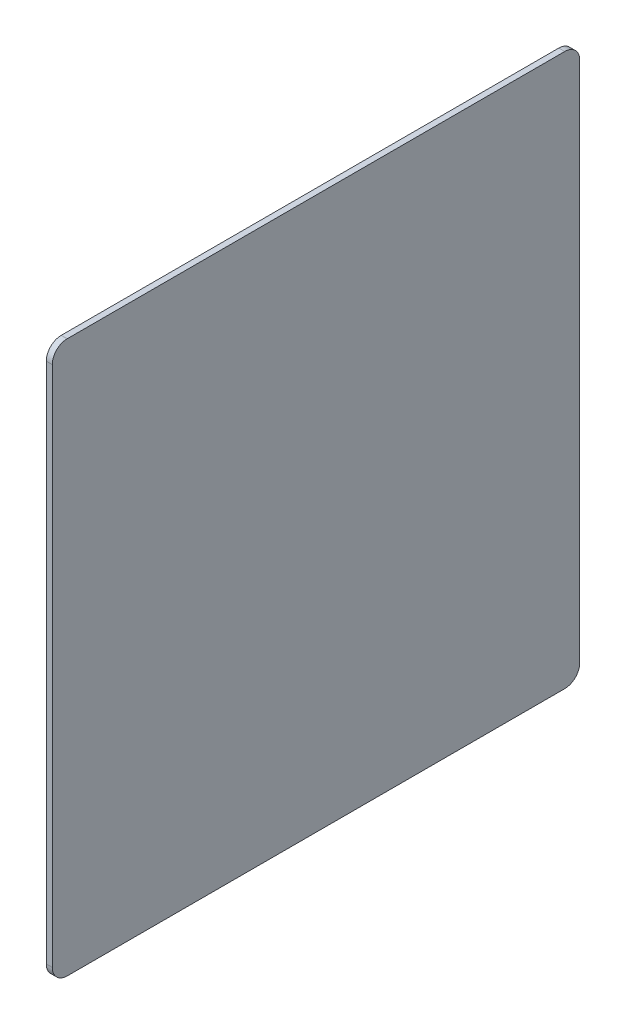
ISO-10303-21;
HEADER;
FILE_DESCRIPTION(('STEP AP214'),'2;1');
FILE_NAME('part.step','',(''),(''),'','','');
FILE_SCHEMA(('AUTOMOTIVE_DESIGN { 1 0 10303 214 1 1 1 1 }'));
ENDSEC;
DATA;
#1=APPLICATION_CONTEXT('core data for automotive mechanical design processes');
#2=APPLICATION_PROTOCOL_DEFINITION('international standard','automotive_design',2000,#1);
#3=PRODUCT_CONTEXT('',#1,'mechanical');
#4=PRODUCT('Part','Part','',(#3));
#5=PRODUCT_RELATED_PRODUCT_CATEGORY('part','',(#4));
#6=PRODUCT_DEFINITION_FORMATION('','',#4);
#7=PRODUCT_DEFINITION_CONTEXT('part definition',#1,'design');
#8=PRODUCT_DEFINITION('design','',#6,#7);
#9=PRODUCT_DEFINITION_SHAPE('','',#8);
#10=(LENGTH_UNIT() NAMED_UNIT(*) SI_UNIT(.MILLI.,.METRE.));
#11=(NAMED_UNIT(*) PLANE_ANGLE_UNIT() SI_UNIT($,.RADIAN.));
#12=(NAMED_UNIT(*) SI_UNIT($,.STERADIAN.) SOLID_ANGLE_UNIT());
#13=UNCERTAINTY_MEASURE_WITH_UNIT(LENGTH_MEASURE(1.E-05),#10,'distance_accuracy_value','');
#14=(GEOMETRIC_REPRESENTATION_CONTEXT(3) GLOBAL_UNCERTAINTY_ASSIGNED_CONTEXT((#13)) GLOBAL_UNIT_ASSIGNED_CONTEXT((#10,
#11,#12)) REPRESENTATION_CONTEXT('',''));
#15=CARTESIAN_POINT('',(0.,0.,0.));
#16=DIRECTION('',(0.,0.,1.));
#17=DIRECTION('',(1.,0.,0.));
#18=AXIS2_PLACEMENT_3D('',#15,#16,#17);
#19=CARTESIAN_POINT('',(-30.,-148.211474761492,32.4));
#20=DIRECTION('',(-1.,0.,0.));
#21=DIRECTION('',(0.,0.,1.));
#22=AXIS2_PLACEMENT_3D('',#19,#20,#21);
#23=CYLINDRICAL_SURFACE('',#22,5.);
#24=CARTESIAN_POINT('',(-32.,-148.211474761492,32.4));
#25=DIRECTION('',(-1.,0.,0.));
#26=DIRECTION('',(0.,0.,1.));
#27=AXIS2_PLACEMENT_3D('',#24,#25,#26);
#28=CIRCLE('',#27,5.);
#29=CARTESIAN_POINT('',(-32.,-148.211474761492,37.4));
#30=VERTEX_POINT('',#29);
#31=CARTESIAN_POINT('',(-32.,-143.211474761492,32.4));
#32=VERTEX_POINT('',#31);
#33=EDGE_CURVE('E141',#30,#32,#28,.T.);
#34=ORIENTED_EDGE('',*,*,#33,.F.);
#35=DIRECTION('',(-1.,0.,0.));
#36=VECTOR('',#35,1.);
#37=CARTESIAN_POINT('',(-30.,-148.211474761492,37.4));
#38=LINE('',#37,#36);
#39=CARTESIAN_POINT('',(-30.,-148.211474761492,37.4));
#40=VERTEX_POINT('',#39);
#41=EDGE_CURVE('E11',#40,#30,#38,.T.);
#42=ORIENTED_EDGE('',*,*,#41,.F.);
#43=CARTESIAN_POINT('',(-30.,-148.211474761492,32.4));
#44=DIRECTION('',(-1.,0.,0.));
#45=DIRECTION('',(0.,0.,1.));
#46=AXIS2_PLACEMENT_3D('',#43,#44,#45);
#47=CIRCLE('',#46,5.);
#48=CARTESIAN_POINT('',(-30.,-143.211474761492,32.4));
#49=VERTEX_POINT('',#48);
#50=EDGE_CURVE('E169',#40,#49,#47,.T.);
#51=ORIENTED_EDGE('',*,*,#50,.T.);
#52=DIRECTION('',(-1.,0.,0.));
#53=VECTOR('',#52,1.);
#54=CARTESIAN_POINT('',(-30.,-143.211474761492,32.4));
#55=LINE('',#54,#53);
#56=EDGE_CURVE('E40',#49,#32,#55,.T.);
#57=ORIENTED_EDGE('',*,*,#56,.T.);
#58=EDGE_LOOP('',(#34,#42,#51,#57));
#59=FACE_BOUND('',#58,.T.);
#60=ADVANCED_FACE('F37',(#59),#23,.T.);
#61=CARTESIAN_POINT('',(-30.,-323.191488077077,37.4));
#62=DIRECTION('',(0.,0.,1.));
#63=DIRECTION('',(1.,0.,0.));
#64=AXIS2_PLACEMENT_3D('',#61,#62,#63);
#65=PLANE('',#64);
#66=DIRECTION('',(0.,1.,0.));
#67=VECTOR('',#66,1.);
#68=CARTESIAN_POINT('',(-32.,-323.191488077077,37.4));
#69=LINE('',#68,#67);
#70=CARTESIAN_POINT('',(-32.,-323.191488077077,37.4));
#71=VERTEX_POINT('',#70);
#72=EDGE_CURVE('E166',#71,#30,#69,.T.);
#73=ORIENTED_EDGE('',*,*,#72,.F.);
#74=DIRECTION('',(-1.,0.,0.));
#75=VECTOR('',#74,1.);
#76=CARTESIAN_POINT('',(-30.,-323.191488077077,37.4));
#77=LINE('',#76,#75);
#78=CARTESIAN_POINT('',(-30.,-323.191488077077,37.4));
#79=VERTEX_POINT('',#78);
#80=EDGE_CURVE('E47',#79,#71,#77,.T.);
#81=ORIENTED_EDGE('',*,*,#80,.F.);
#82=DIRECTION('',(0.,1.,0.));
#83=VECTOR('',#82,1.);
#84=CARTESIAN_POINT('',(-30.,-323.191488077077,37.4));
#85=LINE('',#84,#83);
#86=EDGE_CURVE('E126',#79,#40,#85,.T.);
#87=ORIENTED_EDGE('',*,*,#86,.T.);
#88=ORIENTED_EDGE('',*,*,#41,.T.);
#89=EDGE_LOOP('',(#73,#81,#87,#88));
#90=FACE_BOUND('',#89,.T.);
#91=ADVANCED_FACE('F189',(#90),#65,.T.);
#92=CARTESIAN_POINT('',(-30.,-323.191488077077,32.4));
#93=DIRECTION('',(-1.,0.,0.));
#94=DIRECTION('',(0.,0.,1.));
#95=AXIS2_PLACEMENT_3D('',#92,#93,#94);
#96=CYLINDRICAL_SURFACE('',#95,5.);
#97=CARTESIAN_POINT('',(-32.,-323.191488077077,32.4));
#98=DIRECTION('',(-1.,0.,0.));
#99=DIRECTION('',(0.,0.,1.));
#100=AXIS2_PLACEMENT_3D('',#97,#98,#99);
#101=CIRCLE('',#100,5.);
#102=CARTESIAN_POINT('',(-32.,-328.191488077077,32.4));
#103=VERTEX_POINT('',#102);
#104=EDGE_CURVE('E112',#103,#71,#101,.T.);
#105=ORIENTED_EDGE('',*,*,#104,.F.);
#106=DIRECTION('',(-1.,0.,0.));
#107=VECTOR('',#106,1.);
#108=CARTESIAN_POINT('',(-30.,-328.191488077077,32.4));
#109=LINE('',#108,#107);
#110=CARTESIAN_POINT('',(-30.,-328.191488077077,32.4));
#111=VERTEX_POINT('',#110);
#112=EDGE_CURVE('E107',#111,#103,#109,.T.);
#113=ORIENTED_EDGE('',*,*,#112,.F.);
#114=CARTESIAN_POINT('',(-30.,-323.191488077077,32.4));
#115=DIRECTION('',(-1.,0.,0.));
#116=DIRECTION('',(0.,0.,1.));
#117=AXIS2_PLACEMENT_3D('',#114,#115,#116);
#118=CIRCLE('',#117,5.);
#119=EDGE_CURVE('E110',#111,#79,#118,.T.);
#120=ORIENTED_EDGE('',*,*,#119,.T.);
#121=ORIENTED_EDGE('',*,*,#80,.T.);
#122=EDGE_LOOP('',(#105,#113,#120,#121));
#123=FACE_BOUND('',#122,.T.);
#124=ADVANCED_FACE('F109',(#123),#96,.T.);
#125=CARTESIAN_POINT('',(-30.,-328.191488077077,-134.4));
#126=DIRECTION('',(0.,-1.,0.));
#127=DIRECTION('',(0.,0.,-1.));
#128=AXIS2_PLACEMENT_3D('',#125,#126,#127);
#129=PLANE('',#128);
#130=DIRECTION('',(0.,0.,1.));
#131=VECTOR('',#130,1.);
#132=CARTESIAN_POINT('',(-32.,-328.191488077077,-134.4));
#133=LINE('',#132,#131);
#134=CARTESIAN_POINT('',(-32.,-328.191488077077,-134.4));
#135=VERTEX_POINT('',#134);
#136=EDGE_CURVE('E161',#135,#103,#133,.T.);
#137=ORIENTED_EDGE('',*,*,#136,.F.);
#138=DIRECTION('',(-1.,0.,0.));
#139=VECTOR('',#138,1.);
#140=CARTESIAN_POINT('',(-30.,-328.191488077077,-134.4));
#141=LINE('',#140,#139);
#142=CARTESIAN_POINT('',(-30.,-328.191488077077,-134.4));
#143=VERTEX_POINT('',#142);
#144=EDGE_CURVE('E118',#143,#135,#141,.T.);
#145=ORIENTED_EDGE('',*,*,#144,.F.);
#146=DIRECTION('',(0.,0.,1.));
#147=VECTOR('',#146,1.);
#148=CARTESIAN_POINT('',(-30.,-328.191488077077,-134.4));
#149=LINE('',#148,#147);
#150=EDGE_CURVE('E124',#143,#111,#149,.T.);
#151=ORIENTED_EDGE('',*,*,#150,.T.);
#152=ORIENTED_EDGE('',*,*,#112,.T.);
#153=EDGE_LOOP('',(#137,#145,#151,#152));
#154=FACE_BOUND('',#153,.T.);
#155=ADVANCED_FACE('F129',(#154),#129,.T.);
#156=CARTESIAN_POINT('',(-30.,-323.191488077077,-134.4));
#157=DIRECTION('',(-1.,0.,0.));
#158=DIRECTION('',(0.,0.,1.));
#159=AXIS2_PLACEMENT_3D('',#156,#157,#158);
#160=CYLINDRICAL_SURFACE('',#159,5.);
#161=CARTESIAN_POINT('',(-32.,-323.191488077077,-134.4));
#162=DIRECTION('',(-1.,0.,0.));
#163=DIRECTION('',(0.,0.,1.));
#164=AXIS2_PLACEMENT_3D('',#161,#162,#163);
#165=CIRCLE('',#164,5.);
#166=CARTESIAN_POINT('',(-32.,-323.191488077077,-139.4));
#167=VERTEX_POINT('',#166);
#168=EDGE_CURVE('E157',#167,#135,#165,.T.);
#169=ORIENTED_EDGE('',*,*,#168,.F.);
#170=DIRECTION('',(-1.,0.,0.));
#171=VECTOR('',#170,1.);
#172=CARTESIAN_POINT('',(-30.,-323.191488077077,-139.4));
#173=LINE('',#172,#171);
#174=CARTESIAN_POINT('',(-30.,-323.191488077077,-139.4));
#175=VERTEX_POINT('',#174);
#176=EDGE_CURVE('E175',#175,#167,#173,.T.);
#177=ORIENTED_EDGE('',*,*,#176,.F.);
#178=CARTESIAN_POINT('',(-30.,-323.191488077077,-134.4));
#179=DIRECTION('',(-1.,0.,0.));
#180=DIRECTION('',(0.,0.,1.));
#181=AXIS2_PLACEMENT_3D('',#178,#179,#180);
#182=CIRCLE('',#181,5.);
#183=EDGE_CURVE('E131',#175,#143,#182,.T.);
#184=ORIENTED_EDGE('',*,*,#183,.T.);
#185=ORIENTED_EDGE('',*,*,#144,.T.);
#186=EDGE_LOOP('',(#169,#177,#184,#185));
#187=FACE_BOUND('',#186,.T.);
#188=ADVANCED_FACE('F202',(#187),#160,.T.);
#189=CARTESIAN_POINT('',(-30.,-148.211474761492,-139.4));
#190=DIRECTION('',(0.,0.,-1.));
#191=DIRECTION('',(-1.,0.,0.));
#192=AXIS2_PLACEMENT_3D('',#189,#190,#191);
#193=PLANE('',#192);
#194=DIRECTION('',(0.,-1.,0.));
#195=VECTOR('',#194,1.);
#196=CARTESIAN_POINT('',(-32.,-148.211474761492,-139.4));
#197=LINE('',#196,#195);
#198=CARTESIAN_POINT('',(-32.,-148.211474761492,-139.4));
#199=VERTEX_POINT('',#198);
#200=EDGE_CURVE('E153',#199,#167,#197,.T.);
#201=ORIENTED_EDGE('',*,*,#200,.F.);
#202=DIRECTION('',(-1.,0.,0.));
#203=VECTOR('',#202,1.);
#204=CARTESIAN_POINT('',(-30.,-148.211474761492,-139.4));
#205=LINE('',#204,#203);
#206=CARTESIAN_POINT('',(-30.,-148.211474761492,-139.4));
#207=VERTEX_POINT('',#206);
#208=EDGE_CURVE('E178',#207,#199,#205,.T.);
#209=ORIENTED_EDGE('',*,*,#208,.F.);
#210=DIRECTION('',(0.,-1.,0.));
#211=VECTOR('',#210,1.);
#212=CARTESIAN_POINT('',(-30.,-148.211474761492,-139.4));
#213=LINE('',#212,#211);
#214=EDGE_CURVE('E135',#207,#175,#213,.T.);
#215=ORIENTED_EDGE('',*,*,#214,.T.);
#216=ORIENTED_EDGE('',*,*,#176,.T.);
#217=EDGE_LOOP('',(#201,#209,#215,#216));
#218=FACE_BOUND('',#217,.T.);
#219=ADVANCED_FACE('F205',(#218),#193,.T.);
#220=CARTESIAN_POINT('',(-30.,-148.211474761492,-134.4));
#221=DIRECTION('',(-1.,0.,0.));
#222=DIRECTION('',(0.,0.,1.));
#223=AXIS2_PLACEMENT_3D('',#220,#221,#222);
#224=CYLINDRICAL_SURFACE('',#223,5.);
#225=CARTESIAN_POINT('',(-32.,-148.211474761492,-134.4));
#226=DIRECTION('',(-1.,0.,0.));
#227=DIRECTION('',(0.,0.,-1.));
#228=AXIS2_PLACEMENT_3D('',#225,#226,#227);
#229=CIRCLE('',#228,5.);
#230=CARTESIAN_POINT('',(-32.,-143.211474761492,-134.4));
#231=VERTEX_POINT('',#230);
#232=EDGE_CURVE('E149',#231,#199,#229,.T.);
#233=ORIENTED_EDGE('',*,*,#232,.F.);
#234=DIRECTION('',(-1.,0.,0.));
#235=VECTOR('',#234,1.);
#236=CARTESIAN_POINT('',(-30.,-143.211474761492,-134.4));
#237=LINE('',#236,#235);
#238=CARTESIAN_POINT('',(-30.,-143.211474761492,-134.4));
#239=VERTEX_POINT('',#238);
#240=EDGE_CURVE('E180',#239,#231,#237,.T.);
#241=ORIENTED_EDGE('',*,*,#240,.F.);
#242=CARTESIAN_POINT('',(-30.,-148.211474761492,-134.4));
#243=DIRECTION('',(-1.,0.,0.));
#244=DIRECTION('',(0.,0.,-1.));
#245=AXIS2_PLACEMENT_3D('',#242,#243,#244);
#246=CIRCLE('',#245,5.);
#247=EDGE_CURVE('E300',#239,#207,#246,.T.);
#248=ORIENTED_EDGE('',*,*,#247,.T.);
#249=ORIENTED_EDGE('',*,*,#208,.T.);
#250=EDGE_LOOP('',(#233,#241,#248,#249));
#251=FACE_BOUND('',#250,.T.);
#252=ADVANCED_FACE('F209',(#251),#224,.T.);
#253=CARTESIAN_POINT('',(-30.,-143.211474761492,32.4));
#254=DIRECTION('',(0.,1.,0.));
#255=DIRECTION('',(0.,0.,1.));
#256=AXIS2_PLACEMENT_3D('',#253,#254,#255);
#257=PLANE('',#256);
#258=DIRECTION('',(0.,0.,-1.));
#259=VECTOR('',#258,1.);
#260=CARTESIAN_POINT('',(-32.,-143.211474761492,32.4));
#261=LINE('',#260,#259);
#262=EDGE_CURVE('E145',#32,#231,#261,.T.);
#263=ORIENTED_EDGE('',*,*,#262,.F.);
#264=ORIENTED_EDGE('',*,*,#56,.F.);
#265=DIRECTION('',(0.,0.,-1.));
#266=VECTOR('',#265,1.);
#267=CARTESIAN_POINT('',(-30.,-143.211474761492,32.4));
#268=LINE('',#267,#266);
#269=EDGE_CURVE('E303',#49,#239,#268,.T.);
#270=ORIENTED_EDGE('',*,*,#269,.T.);
#271=ORIENTED_EDGE('',*,*,#240,.T.);
#272=EDGE_LOOP('',(#263,#264,#270,#271));
#273=FACE_BOUND('',#272,.T.);
#274=ADVANCED_FACE('F186',(#273),#257,.T.);
#275=CARTESIAN_POINT('',(-30.,-148.211474761492,32.4));
#276=DIRECTION('',(-1.,0.,0.));
#277=DIRECTION('',(0.,0.,1.));
#278=AXIS2_PLACEMENT_3D('',#275,#276,#277);
#279=PLANE('',#278);
#280=ORIENTED_EDGE('',*,*,#50,.F.);
#281=ORIENTED_EDGE('',*,*,#86,.F.);
#282=ORIENTED_EDGE('',*,*,#119,.F.);
#283=ORIENTED_EDGE('',*,*,#150,.F.);
#284=ORIENTED_EDGE('',*,*,#183,.F.);
#285=ORIENTED_EDGE('',*,*,#214,.F.);
#286=ORIENTED_EDGE('',*,*,#247,.F.);
#287=ORIENTED_EDGE('',*,*,#269,.F.);
#288=EDGE_LOOP('',(#280,#281,#282,#283,#284,#285,#286,#287));
#289=FACE_BOUND('',#288,.T.);
#290=ADVANCED_FACE('F122',(#289),#279,.F.);
#291=CARTESIAN_POINT('',(-32.,-148.211474761492,32.4));
#292=DIRECTION('',(-1.,0.,0.));
#293=DIRECTION('',(0.,0.,1.));
#294=AXIS2_PLACEMENT_3D('',#291,#292,#293);
#295=PLANE('',#294);
#296=ORIENTED_EDGE('',*,*,#33,.T.);
#297=ORIENTED_EDGE('',*,*,#262,.T.);
#298=ORIENTED_EDGE('',*,*,#232,.T.);
#299=ORIENTED_EDGE('',*,*,#200,.T.);
#300=ORIENTED_EDGE('',*,*,#168,.T.);
#301=ORIENTED_EDGE('',*,*,#136,.T.);
#302=ORIENTED_EDGE('',*,*,#104,.T.);
#303=ORIENTED_EDGE('',*,*,#72,.T.);
#304=EDGE_LOOP('',(#296,#297,#298,#299,#300,#301,#302,#303));
#305=FACE_BOUND('',#304,.T.);
#306=ADVANCED_FACE('F188',(#305),#295,.T.);
#307=CLOSED_SHELL('',(#60,#91,#124,#155,#188,#219,#252,#274,#290,#306));
#308=MANIFOLD_SOLID_BREP('B2',#307);
#309=ADVANCED_BREP_SHAPE_REPRESENTATION('',(#18,#308),#14);
#310=SHAPE_DEFINITION_REPRESENTATION(#9,#309);
ENDSEC;
END-ISO-10303-21;
